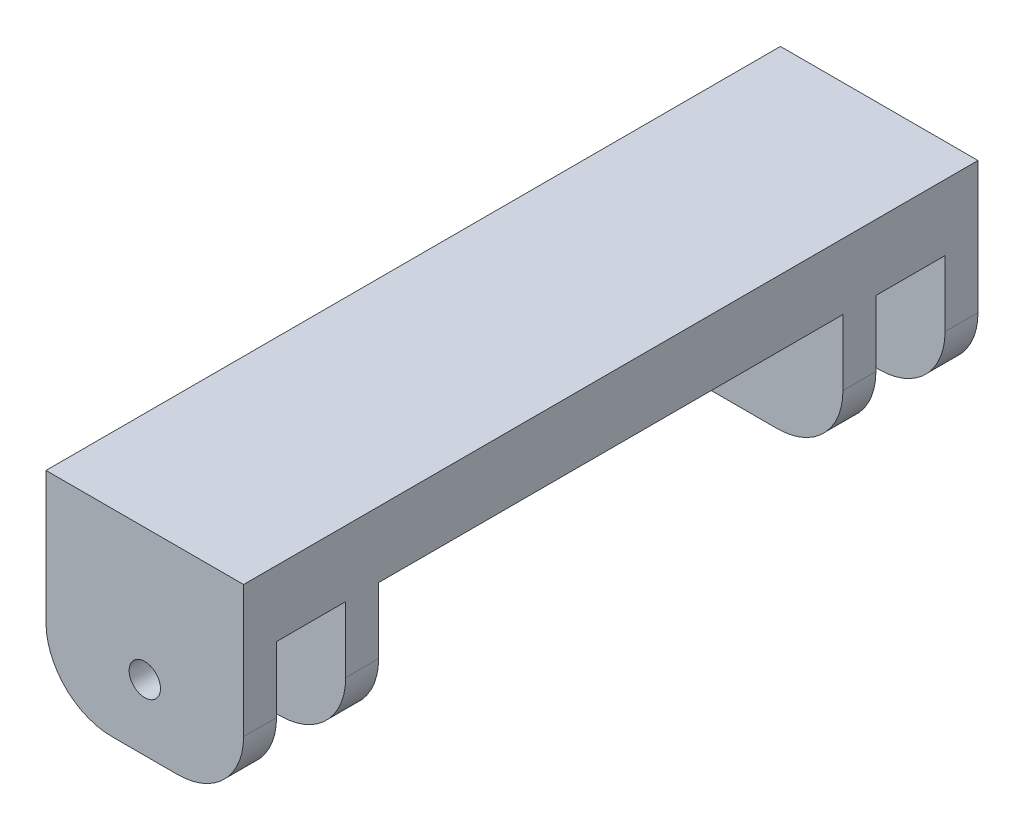
ISO-10303-21;
HEADER;
FILE_DESCRIPTION(('STEP AP214'),'2;1');
FILE_NAME('part.step','',(''),(''),'','','');
FILE_SCHEMA(('AUTOMOTIVE_DESIGN { 1 0 10303 214 1 1 1 1 }'));
ENDSEC;
DATA;
#1=APPLICATION_CONTEXT('core data for automotive mechanical design processes');
#2=APPLICATION_PROTOCOL_DEFINITION('international standard','automotive_design',2000,#1);
#3=PRODUCT_CONTEXT('',#1,'mechanical');
#4=PRODUCT('Part','Part','',(#3));
#5=PRODUCT_RELATED_PRODUCT_CATEGORY('part','',(#4));
#6=PRODUCT_DEFINITION_FORMATION('','',#4);
#7=PRODUCT_DEFINITION_CONTEXT('part definition',#1,'design');
#8=PRODUCT_DEFINITION('design','',#6,#7);
#9=PRODUCT_DEFINITION_SHAPE('','',#8);
#10=(LENGTH_UNIT() NAMED_UNIT(*) SI_UNIT(.MILLI.,.METRE.));
#11=(NAMED_UNIT(*) PLANE_ANGLE_UNIT() SI_UNIT($,.RADIAN.));
#12=(NAMED_UNIT(*) SI_UNIT($,.STERADIAN.) SOLID_ANGLE_UNIT());
#13=UNCERTAINTY_MEASURE_WITH_UNIT(LENGTH_MEASURE(1.E-05),#10,'distance_accuracy_value','');
#14=(GEOMETRIC_REPRESENTATION_CONTEXT(3) GLOBAL_UNCERTAINTY_ASSIGNED_CONTEXT((#13)) GLOBAL_UNIT_ASSIGNED_CONTEXT((#10,
#11,#12)) REPRESENTATION_CONTEXT('',''));
#15=CARTESIAN_POINT('',(0.,0.,0.));
#16=DIRECTION('',(0.,0.,1.));
#17=DIRECTION('',(1.,0.,0.));
#18=AXIS2_PLACEMENT_3D('',#15,#16,#17);
#19=CARTESIAN_POINT('',(0.,0.,111.5));
#20=DIRECTION('',(0.,1.,0.));
#21=DIRECTION('',(0.,0.,1.));
#22=AXIS2_PLACEMENT_3D('',#19,#20,#21);
#23=PLANE('',#22);
#24=DIRECTION('',(-1.,0.,0.));
#25=VECTOR('',#24,1.);
#26=CARTESIAN_POINT('',(30.,0.,96.));
#27=LINE('',#26,#25);
#28=CARTESIAN_POINT('',(30.,0.,96.));
#29=VERTEX_POINT('',#28);
#30=CARTESIAN_POINT('',(0.,0.,96.));
#31=VERTEX_POINT('',#30);
#32=EDGE_CURVE('E203',#29,#31,#27,.T.);
#33=ORIENTED_EDGE('',*,*,#32,.F.);
#34=DIRECTION('',(0.,0.,-1.));
#35=VECTOR('',#34,1.);
#36=CARTESIAN_POINT('',(30.,0.,111.5));
#37=LINE('',#36,#35);
#38=CARTESIAN_POINT('',(30.,0.,106.5));
#39=VERTEX_POINT('',#38);
#40=EDGE_CURVE('E215',#39,#29,#37,.T.);
#41=ORIENTED_EDGE('',*,*,#40,.F.);
#42=DIRECTION('',(1.,0.,0.));
#43=VECTOR('',#42,1.);
#44=CARTESIAN_POINT('',(0.,0.,106.5));
#45=LINE('',#44,#43);
#46=CARTESIAN_POINT('',(0.,0.,106.5));
#47=VERTEX_POINT('',#46);
#48=EDGE_CURVE('E209',#47,#39,#45,.T.);
#49=ORIENTED_EDGE('',*,*,#48,.F.);
#50=DIRECTION('',(0.,0.,-1.));
#51=VECTOR('',#50,1.);
#52=CARTESIAN_POINT('',(0.,0.,111.5));
#53=LINE('',#52,#51);
#54=EDGE_CURVE('E217',#47,#31,#53,.T.);
#55=ORIENTED_EDGE('',*,*,#54,.T.);
#56=EDGE_LOOP('',(#33,#41,#49,#55));
#57=FACE_BOUND('',#56,.T.);
#58=ADVANCED_FACE('F35',(#57),#23,.F.);
#59=DIRECTION('',(1.,0.,0.));
#60=VECTOR('',#59,1.);
#61=CARTESIAN_POINT('',(30.,0.,91.));
#62=LINE('',#61,#60);
#63=CARTESIAN_POINT('',(0.,0.,91.));
#64=VERTEX_POINT('',#63);
#65=CARTESIAN_POINT('',(30.,0.,91.));
#66=VERTEX_POINT('',#65);
#67=EDGE_CURVE('E218',#64,#66,#62,.T.);
#68=ORIENTED_EDGE('',*,*,#67,.F.);
#69=CARTESIAN_POINT('',(0.,0.,20.5));
#70=VERTEX_POINT('',#69);
#71=EDGE_CURVE('E231',#64,#70,#53,.T.);
#72=ORIENTED_EDGE('',*,*,#71,.T.);
#73=DIRECTION('',(-1.,0.,0.));
#74=VECTOR('',#73,1.);
#75=CARTESIAN_POINT('',(30.,0.,20.5));
#76=LINE('',#75,#74);
#77=CARTESIAN_POINT('',(30.,0.,20.5));
#78=VERTEX_POINT('',#77);
#79=EDGE_CURVE('E288',#78,#70,#76,.T.);
#80=ORIENTED_EDGE('',*,*,#79,.F.);
#81=EDGE_CURVE('E227',#66,#78,#37,.T.);
#82=ORIENTED_EDGE('',*,*,#81,.F.);
#83=EDGE_LOOP('',(#68,#72,#80,#82));
#84=FACE_BOUND('',#83,.T.);
#85=ADVANCED_FACE('F441',(#84),#23,.F.);
#86=DIRECTION('',(1.,0.,0.));
#87=VECTOR('',#86,1.);
#88=CARTESIAN_POINT('',(30.,0.,15.5));
#89=LINE('',#88,#87);
#90=CARTESIAN_POINT('',(0.,0.,15.5));
#91=VERTEX_POINT('',#90);
#92=CARTESIAN_POINT('',(30.,0.,15.5));
#93=VERTEX_POINT('',#92);
#94=EDGE_CURVE('E284',#91,#93,#89,.T.);
#95=ORIENTED_EDGE('',*,*,#94,.F.);
#96=CARTESIAN_POINT('',(0.,0.,5.));
#97=VERTEX_POINT('',#96);
#98=EDGE_CURVE('E226',#91,#97,#53,.T.);
#99=ORIENTED_EDGE('',*,*,#98,.T.);
#100=DIRECTION('',(-1.,0.,0.));
#101=VECTOR('',#100,1.);
#102=CARTESIAN_POINT('',(0.,0.,5.));
#103=LINE('',#102,#101);
#104=CARTESIAN_POINT('',(30.,0.,5.00000000000003));
#105=VERTEX_POINT('',#104);
#106=EDGE_CURVE('E267',#105,#97,#103,.T.);
#107=ORIENTED_EDGE('',*,*,#106,.F.);
#108=EDGE_CURVE('E229',#93,#105,#37,.T.);
#109=ORIENTED_EDGE('',*,*,#108,.F.);
#110=EDGE_LOOP('',(#95,#99,#107,#109));
#111=FACE_BOUND('',#110,.T.);
#112=ADVANCED_FACE('F474',(#111),#23,.F.);
#113=CARTESIAN_POINT('',(0.,0.,111.5));
#114=DIRECTION('',(1.,0.,0.));
#115=DIRECTION('',(0.,0.,-1.));
#116=AXIS2_PLACEMENT_3D('',#113,#114,#115);
#117=PLANE('',#116);
#118=DIRECTION('',(0.,1.,0.));
#119=VECTOR('',#118,1.);
#120=CARTESIAN_POINT('',(0.,-20.,15.5));
#121=LINE('',#120,#119);
#122=CARTESIAN_POINT('',(0.,-10.,15.5));
#123=VERTEX_POINT('',#122);
#124=EDGE_CURVE('E279',#123,#91,#121,.T.);
#125=ORIENTED_EDGE('',*,*,#124,.F.);
#126=DIRECTION('',(0.,0.,-1.));
#127=VECTOR('',#126,1.);
#128=CARTESIAN_POINT('',(0.,-10.,20.5));
#129=LINE('',#128,#127);
#130=CARTESIAN_POINT('',(0.,-10.,20.5));
#131=VERTEX_POINT('',#130);
#132=EDGE_CURVE('E383',#123,#131,#129,.F.);
#133=ORIENTED_EDGE('',*,*,#132,.T.);
#134=DIRECTION('',(0.,1.,0.));
#135=VECTOR('',#134,1.);
#136=CARTESIAN_POINT('',(0.,-20.,20.5));
#137=LINE('',#136,#135);
#138=EDGE_CURVE('E277',#131,#70,#137,.T.);
#139=ORIENTED_EDGE('',*,*,#138,.T.);
#140=ORIENTED_EDGE('',*,*,#71,.F.);
#141=DIRECTION('',(0.,1.,0.));
#142=VECTOR('',#141,1.);
#143=CARTESIAN_POINT('',(0.,-20.,91.));
#144=LINE('',#143,#142);
#145=CARTESIAN_POINT('',(0.,-10.,91.));
#146=VERTEX_POINT('',#145);
#147=EDGE_CURVE('E305',#146,#64,#144,.T.);
#148=ORIENTED_EDGE('',*,*,#147,.F.);
#149=DIRECTION('',(0.,0.,-1.));
#150=VECTOR('',#149,1.);
#151=CARTESIAN_POINT('',(0.,-10.,111.5));
#152=LINE('',#151,#150);
#153=CARTESIAN_POINT('',(0.,-10.,96.));
#154=VERTEX_POINT('',#153);
#155=EDGE_CURVE('E373',#146,#154,#152,.F.);
#156=ORIENTED_EDGE('',*,*,#155,.T.);
#157=DIRECTION('',(0.,1.,0.));
#158=VECTOR('',#157,1.);
#159=CARTESIAN_POINT('',(0.,-20.,96.));
#160=LINE('',#159,#158);
#161=EDGE_CURVE('E210',#154,#31,#160,.T.);
#162=ORIENTED_EDGE('',*,*,#161,.T.);
#163=ORIENTED_EDGE('',*,*,#54,.F.);
#164=DIRECTION('',(0.,1.,0.));
#165=VECTOR('',#164,1.);
#166=CARTESIAN_POINT('',(0.,-20.,106.5));
#167=LINE('',#166,#165);
#168=CARTESIAN_POINT('',(0.,-10.,106.5));
#169=VERTEX_POINT('',#168);
#170=EDGE_CURVE('E291',#169,#47,#167,.T.);
#171=ORIENTED_EDGE('',*,*,#170,.F.);
#172=DIRECTION('',(0.,0.,-1.));
#173=VECTOR('',#172,1.);
#174=CARTESIAN_POINT('',(0.,-10.,111.5));
#175=LINE('',#174,#173);
#176=CARTESIAN_POINT('',(0.,-10.,111.5));
#177=VERTEX_POINT('',#176);
#178=EDGE_CURVE('E372',#169,#177,#175,.F.);
#179=ORIENTED_EDGE('',*,*,#178,.T.);
#180=DIRECTION('',(0.,-1.,0.));
#181=VECTOR('',#180,1.);
#182=CARTESIAN_POINT('',(0.,0.,111.5));
#183=LINE('',#182,#181);
#184=CARTESIAN_POINT('',(0.,10.,111.5));
#185=VERTEX_POINT('',#184);
#186=EDGE_CURVE('E252',#185,#177,#183,.T.);
#187=ORIENTED_EDGE('',*,*,#186,.F.);
#188=DIRECTION('',(0.,0.,-1.));
#189=VECTOR('',#188,1.);
#190=CARTESIAN_POINT('',(0.,10.,111.5));
#191=LINE('',#190,#189);
#192=CARTESIAN_POINT('',(0.,10.,0.));
#193=VERTEX_POINT('',#192);
#194=EDGE_CURVE('E241',#185,#193,#191,.T.);
#195=ORIENTED_EDGE('',*,*,#194,.T.);
#196=DIRECTION('',(0.,-1.,0.));
#197=VECTOR('',#196,1.);
#198=CARTESIAN_POINT('',(0.,0.,0.));
#199=LINE('',#198,#197);
#200=CARTESIAN_POINT('',(0.,-10.,0.));
#201=VERTEX_POINT('',#200);
#202=EDGE_CURVE('E255',#193,#201,#199,.T.);
#203=ORIENTED_EDGE('',*,*,#202,.T.);
#204=DIRECTION('',(0.,0.,-1.));
#205=VECTOR('',#204,1.);
#206=CARTESIAN_POINT('',(0.,-10.,111.5));
#207=LINE('',#206,#205);
#208=CARTESIAN_POINT('',(0.,-10.,5.));
#209=VERTEX_POINT('',#208);
#210=EDGE_CURVE('E376',#201,#209,#207,.F.);
#211=ORIENTED_EDGE('',*,*,#210,.T.);
#212=DIRECTION('',(0.,1.,0.));
#213=VECTOR('',#212,1.);
#214=CARTESIAN_POINT('',(0.,-20.,5.));
#215=LINE('',#214,#213);
#216=EDGE_CURVE('E264',#209,#97,#215,.T.);
#217=ORIENTED_EDGE('',*,*,#216,.T.);
#218=ORIENTED_EDGE('',*,*,#98,.F.);
#219=EDGE_LOOP('',(#125,#133,#139,#140,#148,#156,#162,#163,#171,#179,#187,#195,#203,#211,#217,#218));
#220=FACE_BOUND('',#219,.T.);
#221=ADVANCED_FACE('F370',(#220),#117,.F.);
#222=CARTESIAN_POINT('',(30.,0.,111.5));
#223=DIRECTION('',(-1.,0.,0.));
#224=DIRECTION('',(0.,0.,1.));
#225=AXIS2_PLACEMENT_3D('',#222,#223,#224);
#226=PLANE('',#225);
#227=DIRECTION('',(0.,1.,0.));
#228=VECTOR('',#227,1.);
#229=CARTESIAN_POINT('',(30.,-20.,20.5));
#230=LINE('',#229,#228);
#231=CARTESIAN_POINT('',(30.,-10.,20.5));
#232=VERTEX_POINT('',#231);
#233=EDGE_CURVE('E271',#232,#78,#230,.T.);
#234=ORIENTED_EDGE('',*,*,#233,.F.);
#235=DIRECTION('',(0.,0.,1.));
#236=VECTOR('',#235,1.);
#237=CARTESIAN_POINT('',(30.,-10.,15.5));
#238=LINE('',#237,#236);
#239=CARTESIAN_POINT('',(30.,-10.,15.5));
#240=VERTEX_POINT('',#239);
#241=EDGE_CURVE('E395',#232,#240,#238,.F.);
#242=ORIENTED_EDGE('',*,*,#241,.T.);
#243=DIRECTION('',(0.,1.,0.));
#244=VECTOR('',#243,1.);
#245=CARTESIAN_POINT('',(30.,-20.,15.5));
#246=LINE('',#245,#244);
#247=EDGE_CURVE('E281',#240,#93,#246,.T.);
#248=ORIENTED_EDGE('',*,*,#247,.T.);
#249=ORIENTED_EDGE('',*,*,#108,.T.);
#250=DIRECTION('',(0.,1.,0.));
#251=VECTOR('',#250,1.);
#252=CARTESIAN_POINT('',(30.,-20.,5.));
#253=LINE('',#252,#251);
#254=CARTESIAN_POINT('',(30.,-10.,5.));
#255=VERTEX_POINT('',#254);
#256=EDGE_CURVE('E258',#255,#105,#253,.T.);
#257=ORIENTED_EDGE('',*,*,#256,.F.);
#258=DIRECTION('',(0.,0.,1.));
#259=VECTOR('',#258,1.);
#260=CARTESIAN_POINT('',(30.,-10.,111.5));
#261=LINE('',#260,#259);
#262=CARTESIAN_POINT('',(30.,-10.,0.));
#263=VERTEX_POINT('',#262);
#264=EDGE_CURVE('E393',#255,#263,#261,.F.);
#265=ORIENTED_EDGE('',*,*,#264,.T.);
#266=DIRECTION('',(0.,1.,0.));
#267=VECTOR('',#266,1.);
#268=CARTESIAN_POINT('',(30.,0.,0.));
#269=LINE('',#268,#267);
#270=CARTESIAN_POINT('',(30.,10.,0.));
#271=VERTEX_POINT('',#270);
#272=EDGE_CURVE('E253',#263,#271,#269,.T.);
#273=ORIENTED_EDGE('',*,*,#272,.T.);
#274=DIRECTION('',(0.,0.,-1.));
#275=VECTOR('',#274,1.);
#276=CARTESIAN_POINT('',(30.,10.,111.5));
#277=LINE('',#276,#275);
#278=CARTESIAN_POINT('',(30.,10.,111.5));
#279=VERTEX_POINT('',#278);
#280=EDGE_CURVE('E236',#279,#271,#277,.T.);
#281=ORIENTED_EDGE('',*,*,#280,.F.);
#282=DIRECTION('',(0.,1.,0.));
#283=VECTOR('',#282,1.);
#284=CARTESIAN_POINT('',(30.,0.,111.5));
#285=LINE('',#284,#283);
#286=CARTESIAN_POINT('',(30.,-10.,111.5));
#287=VERTEX_POINT('',#286);
#288=EDGE_CURVE('E260',#287,#279,#285,.T.);
#289=ORIENTED_EDGE('',*,*,#288,.F.);
#290=DIRECTION('',(0.,0.,1.));
#291=VECTOR('',#290,1.);
#292=CARTESIAN_POINT('',(30.,-10.,106.5));
#293=LINE('',#292,#291);
#294=CARTESIAN_POINT('',(30.,-10.,106.5));
#295=VERTEX_POINT('',#294);
#296=EDGE_CURVE('E389',#287,#295,#293,.F.);
#297=ORIENTED_EDGE('',*,*,#296,.T.);
#298=DIRECTION('',(0.,1.,0.));
#299=VECTOR('',#298,1.);
#300=CARTESIAN_POINT('',(30.,-20.,106.5));
#301=LINE('',#300,#299);
#302=EDGE_CURVE('E224',#295,#39,#301,.T.);
#303=ORIENTED_EDGE('',*,*,#302,.T.);
#304=ORIENTED_EDGE('',*,*,#40,.T.);
#305=DIRECTION('',(0.,1.,0.));
#306=VECTOR('',#305,1.);
#307=CARTESIAN_POINT('',(30.,-20.,96.));
#308=LINE('',#307,#306);
#309=CARTESIAN_POINT('',(30.,-10.,96.));
#310=VERTEX_POINT('',#309);
#311=EDGE_CURVE('E198',#310,#29,#308,.T.);
#312=ORIENTED_EDGE('',*,*,#311,.F.);
#313=DIRECTION('',(0.,0.,1.));
#314=VECTOR('',#313,1.);
#315=CARTESIAN_POINT('',(30.,-10.,111.5));
#316=LINE('',#315,#314);
#317=CARTESIAN_POINT('',(30.,-10.,91.));
#318=VERTEX_POINT('',#317);
#319=EDGE_CURVE('E391',#310,#318,#316,.F.);
#320=ORIENTED_EDGE('',*,*,#319,.T.);
#321=DIRECTION('',(0.,1.,0.));
#322=VECTOR('',#321,1.);
#323=CARTESIAN_POINT('',(30.,-20.,91.));
#324=LINE('',#323,#322);
#325=EDGE_CURVE('E307',#318,#66,#324,.T.);
#326=ORIENTED_EDGE('',*,*,#325,.T.);
#327=ORIENTED_EDGE('',*,*,#81,.T.);
#328=EDGE_LOOP('',(#234,#242,#248,#249,#257,#265,#273,#281,#289,#297,#303,#304,#312,#320,#326,#327));
#329=FACE_BOUND('',#328,.T.);
#330=ADVANCED_FACE('F222',(#329),#226,.F.);
#331=CARTESIAN_POINT('',(0.,10.,111.5));
#332=DIRECTION('',(0.,-1.,0.));
#333=DIRECTION('',(0.,0.,-1.));
#334=AXIS2_PLACEMENT_3D('',#331,#332,#333);
#335=PLANE('',#334);
#336=DIRECTION('',(-1.,0.,0.));
#337=VECTOR('',#336,1.);
#338=CARTESIAN_POINT('',(0.,10.,0.));
#339=LINE('',#338,#337);
#340=EDGE_CURVE('E250',#271,#193,#339,.T.);
#341=ORIENTED_EDGE('',*,*,#340,.T.);
#342=ORIENTED_EDGE('',*,*,#194,.F.);
#343=DIRECTION('',(-1.,0.,0.));
#344=VECTOR('',#343,1.);
#345=CARTESIAN_POINT('',(0.,10.,111.5));
#346=LINE('',#345,#344);
#347=EDGE_CURVE('E247',#279,#185,#346,.T.);
#348=ORIENTED_EDGE('',*,*,#347,.F.);
#349=ORIENTED_EDGE('',*,*,#280,.T.);
#350=EDGE_LOOP('',(#341,#342,#348,#349));
#351=FACE_BOUND('',#350,.T.);
#352=ADVANCED_FACE('F345',(#351),#335,.F.);
#353=CARTESIAN_POINT('',(0.,0.,111.5));
#354=DIRECTION('',(0.,0.,-1.));
#355=DIRECTION('',(-1.,0.,0.));
#356=AXIS2_PLACEMENT_3D('',#353,#354,#355);
#357=PLANE('',#356);
#358=CARTESIAN_POINT('',(15.,-10.,111.5));
#359=DIRECTION('',(0.,0.,1.));
#360=DIRECTION('',(1.,0.,0.));
#361=AXIS2_PLACEMENT_3D('',#358,#359,#360);
#362=CIRCLE('',#361,2.38124999999999);
#363=CARTESIAN_POINT('',(17.38125,-10.,111.5));
#364=VERTEX_POINT('',#363);
#365=EDGE_CURVE('E335',#364,#364,#362,.T.);
#366=ORIENTED_EDGE('',*,*,#365,.F.);
#367=EDGE_LOOP('',(#366));
#368=FACE_BOUND('',#367,.T.);
#369=DIRECTION('',(-1.,0.,0.));
#370=VECTOR('',#369,1.);
#371=CARTESIAN_POINT('',(0.,-20.,111.5));
#372=LINE('',#371,#370);
#373=CARTESIAN_POINT('',(20.,-20.,111.5));
#374=VERTEX_POINT('',#373);
#375=CARTESIAN_POINT('',(9.99999999999999,-20.,111.5));
#376=VERTEX_POINT('',#375);
#377=EDGE_CURVE('E298',#374,#376,#372,.T.);
#378=ORIENTED_EDGE('',*,*,#377,.F.);
#379=CARTESIAN_POINT('',(20.,-10.,111.5));
#380=DIRECTION('',(0.,0.,-1.));
#381=DIRECTION('',(-1.,0.,0.));
#382=AXIS2_PLACEMENT_3D('',#379,#380,#381);
#383=CIRCLE('',#382,10.);
#384=EDGE_CURVE('E58',#374,#287,#383,.F.);
#385=ORIENTED_EDGE('',*,*,#384,.T.);
#386=ORIENTED_EDGE('',*,*,#288,.T.);
#387=ORIENTED_EDGE('',*,*,#347,.T.);
#388=ORIENTED_EDGE('',*,*,#186,.T.);
#389=CARTESIAN_POINT('',(10.,-10.,111.5));
#390=DIRECTION('',(0.,0.,-1.));
#391=DIRECTION('',(-1.,0.,0.));
#392=AXIS2_PLACEMENT_3D('',#389,#390,#391);
#393=CIRCLE('',#392,10.);
#394=EDGE_CURVE('E50',#177,#376,#393,.F.);
#395=ORIENTED_EDGE('',*,*,#394,.T.);
#396=EDGE_LOOP('',(#378,#385,#386,#387,#388,#395));
#397=FACE_BOUND('',#396,.T.);
#398=ADVANCED_FACE('F342',(#368,#397),#357,.F.);
#399=CARTESIAN_POINT('',(0.,0.,0.));
#400=DIRECTION('',(0.,0.,-1.));
#401=DIRECTION('',(-1.,0.,0.));
#402=AXIS2_PLACEMENT_3D('',#399,#400,#401);
#403=PLANE('',#402);
#404=CARTESIAN_POINT('',(15.,-10.,0.));
#405=DIRECTION('',(0.,0.,1.));
#406=DIRECTION('',(1.,0.,0.));
#407=AXIS2_PLACEMENT_3D('',#404,#405,#406);
#408=CIRCLE('',#407,2.38124999999998);
#409=CARTESIAN_POINT('',(17.38125,-10.,0.));
#410=VERTEX_POINT('',#409);
#411=EDGE_CURVE('E332',#410,#410,#408,.T.);
#412=ORIENTED_EDGE('',*,*,#411,.T.);
#413=EDGE_LOOP('',(#412));
#414=FACE_BOUND('',#413,.T.);
#415=DIRECTION('',(1.,0.,0.));
#416=VECTOR('',#415,1.);
#417=CARTESIAN_POINT('',(0.,-20.,0.));
#418=LINE('',#417,#416);
#419=CARTESIAN_POINT('',(9.99999999999999,-20.,0.));
#420=VERTEX_POINT('',#419);
#421=CARTESIAN_POINT('',(20.,-20.,0.));
#422=VERTEX_POINT('',#421);
#423=EDGE_CURVE('E270',#420,#422,#418,.T.);
#424=ORIENTED_EDGE('',*,*,#423,.F.);
#425=CARTESIAN_POINT('',(10.,-10.,0.));
#426=DIRECTION('',(0.,0.,-1.));
#427=DIRECTION('',(-1.,0.,0.));
#428=AXIS2_PLACEMENT_3D('',#425,#426,#427);
#429=CIRCLE('',#428,10.);
#430=EDGE_CURVE('E405',#420,#201,#429,.T.);
#431=ORIENTED_EDGE('',*,*,#430,.T.);
#432=ORIENTED_EDGE('',*,*,#202,.F.);
#433=ORIENTED_EDGE('',*,*,#340,.F.);
#434=ORIENTED_EDGE('',*,*,#272,.F.);
#435=CARTESIAN_POINT('',(20.,-10.,0.));
#436=DIRECTION('',(0.,0.,-1.));
#437=DIRECTION('',(-1.,0.,0.));
#438=AXIS2_PLACEMENT_3D('',#435,#436,#437);
#439=CIRCLE('',#438,10.);
#440=EDGE_CURVE('E403',#263,#422,#439,.T.);
#441=ORIENTED_EDGE('',*,*,#440,.T.);
#442=EDGE_LOOP('',(#424,#431,#432,#433,#434,#441));
#443=FACE_BOUND('',#442,.T.);
#444=ADVANCED_FACE('F344',(#414,#443),#403,.T.);
#445=CARTESIAN_POINT('',(0.,-20.,5.));
#446=DIRECTION('',(0.,0.,-1.));
#447=DIRECTION('',(-1.,0.,0.));
#448=AXIS2_PLACEMENT_3D('',#445,#446,#447);
#449=PLANE('',#448);
#450=CARTESIAN_POINT('',(15.,-10.,5.));
#451=DIRECTION('',(0.,0.,-1.));
#452=DIRECTION('',(-1.,0.,0.));
#453=AXIS2_PLACEMENT_3D('',#450,#451,#452);
#454=CIRCLE('',#453,2.38124999999998);
#455=CARTESIAN_POINT('',(12.61875,-10.,5.));
#456=VERTEX_POINT('',#455);
#457=EDGE_CURVE('E219',#456,#456,#454,.T.);
#458=ORIENTED_EDGE('',*,*,#457,.T.);
#459=EDGE_LOOP('',(#458));
#460=FACE_BOUND('',#459,.T.);
#461=ORIENTED_EDGE('',*,*,#216,.F.);
#462=CARTESIAN_POINT('',(10.,-10.,5.));
#463=DIRECTION('',(0.,0.,-1.));
#464=DIRECTION('',(-1.,0.,0.));
#465=AXIS2_PLACEMENT_3D('',#462,#463,#464);
#466=CIRCLE('',#465,10.);
#467=CARTESIAN_POINT('',(9.99999999999999,-20.,5.));
#468=VERTEX_POINT('',#467);
#469=EDGE_CURVE('E409',#209,#468,#466,.F.);
#470=ORIENTED_EDGE('',*,*,#469,.T.);
#471=DIRECTION('',(-1.,0.,0.));
#472=VECTOR('',#471,1.);
#473=CARTESIAN_POINT('',(0.,-20.,5.));
#474=LINE('',#473,#472);
#475=CARTESIAN_POINT('',(20.,-20.,5.));
#476=VERTEX_POINT('',#475);
#477=EDGE_CURVE('E266',#476,#468,#474,.T.);
#478=ORIENTED_EDGE('',*,*,#477,.F.);
#479=CARTESIAN_POINT('',(20.,-10.,5.));
#480=DIRECTION('',(0.,0.,-1.));
#481=DIRECTION('',(-1.,0.,0.));
#482=AXIS2_PLACEMENT_3D('',#479,#480,#481);
#483=CIRCLE('',#482,10.);
#484=EDGE_CURVE('E407',#476,#255,#483,.F.);
#485=ORIENTED_EDGE('',*,*,#484,.T.);
#486=ORIENTED_EDGE('',*,*,#256,.T.);
#487=ORIENTED_EDGE('',*,*,#106,.T.);
#488=EDGE_LOOP('',(#461,#470,#478,#485,#486,#487));
#489=FACE_BOUND('',#488,.T.);
#490=ADVANCED_FACE('F476',(#460,#489),#449,.F.);
#491=CARTESIAN_POINT('',(0.,-20.,0.));
#492=DIRECTION('',(0.,1.,0.));
#493=DIRECTION('',(0.,0.,1.));
#494=AXIS2_PLACEMENT_3D('',#491,#492,#493);
#495=PLANE('',#494);
#496=ORIENTED_EDGE('',*,*,#477,.T.);
#497=DIRECTION('',(0.,0.,-1.));
#498=VECTOR('',#497,1.);
#499=CARTESIAN_POINT('',(10.,-20.,0.));
#500=LINE('',#499,#498);
#501=EDGE_CURVE('E400',#468,#420,#500,.T.);
#502=ORIENTED_EDGE('',*,*,#501,.T.);
#503=ORIENTED_EDGE('',*,*,#423,.T.);
#504=DIRECTION('',(0.,0.,1.));
#505=VECTOR('',#504,1.);
#506=CARTESIAN_POINT('',(20.,-20.,0.));
#507=LINE('',#506,#505);
#508=EDGE_CURVE('E397',#422,#476,#507,.T.);
#509=ORIENTED_EDGE('',*,*,#508,.T.);
#510=EDGE_LOOP('',(#496,#502,#503,#509));
#511=FACE_BOUND('',#510,.T.);
#512=ADVANCED_FACE('F488',(#511),#495,.F.);
#513=CARTESIAN_POINT('',(30.,-20.,20.5));
#514=DIRECTION('',(0.,0.,-1.));
#515=DIRECTION('',(-1.,0.,0.));
#516=AXIS2_PLACEMENT_3D('',#513,#514,#515);
#517=PLANE('',#516);
#518=CARTESIAN_POINT('',(15.,-10.,20.5));
#519=DIRECTION('',(0.,0.,-1.));
#520=DIRECTION('',(-1.,0.,0.));
#521=AXIS2_PLACEMENT_3D('',#518,#519,#520);
#522=CIRCLE('',#521,2.38124999999998);
#523=CARTESIAN_POINT('',(12.61875,-10.,20.5));
#524=VERTEX_POINT('',#523);
#525=EDGE_CURVE('E322',#524,#524,#522,.T.);
#526=ORIENTED_EDGE('',*,*,#525,.T.);
#527=EDGE_LOOP('',(#526));
#528=FACE_BOUND('',#527,.T.);
#529=ORIENTED_EDGE('',*,*,#138,.F.);
#530=CARTESIAN_POINT('',(10.,-10.,20.5));
#531=DIRECTION('',(0.,0.,-1.));
#532=DIRECTION('',(-1.,0.,0.));
#533=AXIS2_PLACEMENT_3D('',#530,#531,#532);
#534=CIRCLE('',#533,10.);
#535=CARTESIAN_POINT('',(10.,-20.,20.5));
#536=VERTEX_POINT('',#535);
#537=EDGE_CURVE('E387',#131,#536,#534,.F.);
#538=ORIENTED_EDGE('',*,*,#537,.T.);
#539=DIRECTION('',(-1.,0.,0.));
#540=VECTOR('',#539,1.);
#541=CARTESIAN_POINT('',(30.,-20.,20.5));
#542=LINE('',#541,#540);
#543=CARTESIAN_POINT('',(20.,-20.,20.5));
#544=VERTEX_POINT('',#543);
#545=EDGE_CURVE('E287',#544,#536,#542,.T.);
#546=ORIENTED_EDGE('',*,*,#545,.F.);
#547=CARTESIAN_POINT('',(20.,-10.,20.5));
#548=DIRECTION('',(0.,0.,-1.));
#549=DIRECTION('',(-1.,0.,0.));
#550=AXIS2_PLACEMENT_3D('',#547,#548,#549);
#551=CIRCLE('',#550,10.);
#552=EDGE_CURVE('E385',#544,#232,#551,.F.);
#553=ORIENTED_EDGE('',*,*,#552,.T.);
#554=ORIENTED_EDGE('',*,*,#233,.T.);
#555=ORIENTED_EDGE('',*,*,#79,.T.);
#556=EDGE_LOOP('',(#529,#538,#546,#553,#554,#555));
#557=FACE_BOUND('',#556,.T.);
#558=ADVANCED_FACE('F460',(#528,#557),#517,.F.);
#559=CARTESIAN_POINT('',(30.,-20.,15.5));
#560=DIRECTION('',(0.,0.,1.));
#561=DIRECTION('',(1.,0.,0.));
#562=AXIS2_PLACEMENT_3D('',#559,#560,#561);
#563=PLANE('',#562);
#564=CARTESIAN_POINT('',(15.,-10.,15.5));
#565=DIRECTION('',(0.,0.,1.));
#566=DIRECTION('',(1.,0.,0.));
#567=AXIS2_PLACEMENT_3D('',#564,#565,#566);
#568=CIRCLE('',#567,2.38124999999998);
#569=CARTESIAN_POINT('',(17.38125,-10.,15.5));
#570=VERTEX_POINT('',#569);
#571=EDGE_CURVE('E325',#570,#570,#568,.T.);
#572=ORIENTED_EDGE('',*,*,#571,.T.);
#573=EDGE_LOOP('',(#572));
#574=FACE_BOUND('',#573,.T.);
#575=DIRECTION('',(1.,0.,0.));
#576=VECTOR('',#575,1.);
#577=CARTESIAN_POINT('',(30.,-20.,15.5));
#578=LINE('',#577,#576);
#579=CARTESIAN_POINT('',(10.,-20.,15.5));
#580=VERTEX_POINT('',#579);
#581=CARTESIAN_POINT('',(20.,-20.,15.5));
#582=VERTEX_POINT('',#581);
#583=EDGE_CURVE('E283',#580,#582,#578,.T.);
#584=ORIENTED_EDGE('',*,*,#583,.F.);
#585=CARTESIAN_POINT('',(10.,-10.,15.5));
#586=DIRECTION('',(0.,0.,1.));
#587=DIRECTION('',(1.,0.,0.));
#588=AXIS2_PLACEMENT_3D('',#585,#586,#587);
#589=CIRCLE('',#588,10.);
#590=EDGE_CURVE('E374',#580,#123,#589,.F.);
#591=ORIENTED_EDGE('',*,*,#590,.T.);
#592=ORIENTED_EDGE('',*,*,#124,.T.);
#593=ORIENTED_EDGE('',*,*,#94,.T.);
#594=ORIENTED_EDGE('',*,*,#247,.F.);
#595=CARTESIAN_POINT('',(20.,-10.,15.5));
#596=DIRECTION('',(0.,0.,1.));
#597=DIRECTION('',(1.,0.,0.));
#598=AXIS2_PLACEMENT_3D('',#595,#596,#597);
#599=CIRCLE('',#598,10.);
#600=EDGE_CURVE('E378',#240,#582,#599,.F.);
#601=ORIENTED_EDGE('',*,*,#600,.T.);
#602=EDGE_LOOP('',(#584,#591,#592,#593,#594,#601));
#603=FACE_BOUND('',#602,.T.);
#604=ADVANCED_FACE('F469',(#574,#603),#563,.F.);
#605=CARTESIAN_POINT('',(0.,-20.,0.));
#606=DIRECTION('',(0.,-1.,0.));
#607=DIRECTION('',(0.,0.,-1.));
#608=AXIS2_PLACEMENT_3D('',#605,#606,#607);
#609=PLANE('',#608);
#610=ORIENTED_EDGE('',*,*,#545,.T.);
#611=DIRECTION('',(0.,0.,-1.));
#612=VECTOR('',#611,1.);
#613=CARTESIAN_POINT('',(10.,-20.,15.5));
#614=LINE('',#613,#612);
#615=EDGE_CURVE('E453',#536,#580,#614,.T.);
#616=ORIENTED_EDGE('',*,*,#615,.T.);
#617=ORIENTED_EDGE('',*,*,#583,.T.);
#618=DIRECTION('',(0.,0.,1.));
#619=VECTOR('',#618,1.);
#620=CARTESIAN_POINT('',(20.,-20.,20.5));
#621=LINE('',#620,#619);
#622=EDGE_CURVE('E450',#582,#544,#621,.T.);
#623=ORIENTED_EDGE('',*,*,#622,.T.);
#624=EDGE_LOOP('',(#610,#616,#617,#623));
#625=FACE_BOUND('',#624,.T.);
#626=ADVANCED_FACE('F468',(#625),#609,.T.);
#627=CARTESIAN_POINT('',(0.,-20.,106.5));
#628=DIRECTION('',(0.,0.,1.));
#629=DIRECTION('',(1.,0.,0.));
#630=AXIS2_PLACEMENT_3D('',#627,#628,#629);
#631=PLANE('',#630);
#632=CARTESIAN_POINT('',(15.,-10.,106.5));
#633=DIRECTION('',(0.,0.,1.));
#634=DIRECTION('',(1.,0.,0.));
#635=AXIS2_PLACEMENT_3D('',#632,#633,#634);
#636=CIRCLE('',#635,2.38124999999998);
#637=CARTESIAN_POINT('',(17.38125,-10.,106.5));
#638=VERTEX_POINT('',#637);
#639=EDGE_CURVE('E319',#638,#638,#636,.T.);
#640=ORIENTED_EDGE('',*,*,#639,.T.);
#641=EDGE_LOOP('',(#640));
#642=FACE_BOUND('',#641,.T.);
#643=ORIENTED_EDGE('',*,*,#302,.F.);
#644=CARTESIAN_POINT('',(20.,-10.,106.5));
#645=DIRECTION('',(0.,0.,1.));
#646=DIRECTION('',(1.,0.,0.));
#647=AXIS2_PLACEMENT_3D('',#644,#645,#646);
#648=CIRCLE('',#647,10.);
#649=CARTESIAN_POINT('',(20.,-20.,106.5));
#650=VERTEX_POINT('',#649);
#651=EDGE_CURVE('E11',#295,#650,#648,.F.);
#652=ORIENTED_EDGE('',*,*,#651,.T.);
#653=DIRECTION('',(1.,0.,0.));
#654=VECTOR('',#653,1.);
#655=CARTESIAN_POINT('',(0.,-20.,106.5));
#656=LINE('',#655,#654);
#657=CARTESIAN_POINT('',(9.99999999999999,-20.,106.5));
#658=VERTEX_POINT('',#657);
#659=EDGE_CURVE('E300',#658,#650,#656,.T.);
#660=ORIENTED_EDGE('',*,*,#659,.F.);
#661=CARTESIAN_POINT('',(10.,-10.,106.5));
#662=DIRECTION('',(0.,0.,1.));
#663=DIRECTION('',(1.,0.,0.));
#664=AXIS2_PLACEMENT_3D('',#661,#662,#663);
#665=CIRCLE('',#664,10.);
#666=EDGE_CURVE('E43',#658,#169,#665,.F.);
#667=ORIENTED_EDGE('',*,*,#666,.T.);
#668=ORIENTED_EDGE('',*,*,#170,.T.);
#669=ORIENTED_EDGE('',*,*,#48,.T.);
#670=EDGE_LOOP('',(#643,#652,#660,#667,#668,#669));
#671=FACE_BOUND('',#670,.T.);
#672=ADVANCED_FACE('F367',(#642,#671),#631,.F.);
#673=CARTESIAN_POINT('',(0.,-20.,0.));
#674=DIRECTION('',(0.,-1.,0.));
#675=DIRECTION('',(0.,0.,-1.));
#676=AXIS2_PLACEMENT_3D('',#673,#674,#675);
#677=PLANE('',#676);
#678=ORIENTED_EDGE('',*,*,#659,.T.);
#679=DIRECTION('',(0.,0.,1.));
#680=VECTOR('',#679,1.);
#681=CARTESIAN_POINT('',(20.,-20.,111.5));
#682=LINE('',#681,#680);
#683=EDGE_CURVE('E354',#650,#374,#682,.T.);
#684=ORIENTED_EDGE('',*,*,#683,.T.);
#685=ORIENTED_EDGE('',*,*,#377,.T.);
#686=DIRECTION('',(0.,0.,-1.));
#687=VECTOR('',#686,1.);
#688=CARTESIAN_POINT('',(10.,-20.,106.5));
#689=LINE('',#688,#687);
#690=EDGE_CURVE('E352',#376,#658,#689,.T.);
#691=ORIENTED_EDGE('',*,*,#690,.T.);
#692=EDGE_LOOP('',(#678,#684,#685,#691));
#693=FACE_BOUND('',#692,.T.);
#694=ADVANCED_FACE('F351',(#693),#677,.T.);
#695=CARTESIAN_POINT('',(30.,-20.,96.));
#696=DIRECTION('',(0.,0.,-1.));
#697=DIRECTION('',(-1.,0.,0.));
#698=AXIS2_PLACEMENT_3D('',#695,#696,#697);
#699=PLANE('',#698);
#700=CARTESIAN_POINT('',(15.,-10.,96.));
#701=DIRECTION('',(0.,0.,-1.));
#702=DIRECTION('',(-1.,0.,0.));
#703=AXIS2_PLACEMENT_3D('',#700,#701,#702);
#704=CIRCLE('',#703,2.38124999999998);
#705=CARTESIAN_POINT('',(12.61875,-10.,96.));
#706=VERTEX_POINT('',#705);
#707=EDGE_CURVE('E328',#706,#706,#704,.T.);
#708=ORIENTED_EDGE('',*,*,#707,.T.);
#709=EDGE_LOOP('',(#708));
#710=FACE_BOUND('',#709,.T.);
#711=DIRECTION('',(-1.,0.,0.));
#712=VECTOR('',#711,1.);
#713=CARTESIAN_POINT('',(30.,-20.,96.));
#714=LINE('',#713,#712);
#715=CARTESIAN_POINT('',(20.,-20.,96.));
#716=VERTEX_POINT('',#715);
#717=CARTESIAN_POINT('',(10.,-20.,96.));
#718=VERTEX_POINT('',#717);
#719=EDGE_CURVE('E311',#716,#718,#714,.T.);
#720=ORIENTED_EDGE('',*,*,#719,.F.);
#721=CARTESIAN_POINT('',(20.,-10.,96.));
#722=DIRECTION('',(0.,0.,-1.));
#723=DIRECTION('',(-1.,0.,0.));
#724=AXIS2_PLACEMENT_3D('',#721,#722,#723);
#725=CIRCLE('',#724,10.);
#726=EDGE_CURVE('E205',#716,#310,#725,.F.);
#727=ORIENTED_EDGE('',*,*,#726,.T.);
#728=ORIENTED_EDGE('',*,*,#311,.T.);
#729=ORIENTED_EDGE('',*,*,#32,.T.);
#730=ORIENTED_EDGE('',*,*,#161,.F.);
#731=CARTESIAN_POINT('',(10.,-10.,96.));
#732=DIRECTION('',(0.,0.,-1.));
#733=DIRECTION('',(-1.,0.,0.));
#734=AXIS2_PLACEMENT_3D('',#731,#732,#733);
#735=CIRCLE('',#734,10.);
#736=EDGE_CURVE('E417',#154,#718,#735,.F.);
#737=ORIENTED_EDGE('',*,*,#736,.T.);
#738=EDGE_LOOP('',(#720,#727,#728,#729,#730,#737));
#739=FACE_BOUND('',#738,.T.);
#740=ADVANCED_FACE('F201',(#710,#739),#699,.F.);
#741=CARTESIAN_POINT('',(30.,-20.,91.));
#742=DIRECTION('',(0.,0.,1.));
#743=DIRECTION('',(1.,0.,0.));
#744=AXIS2_PLACEMENT_3D('',#741,#742,#743);
#745=PLANE('',#744);
#746=CARTESIAN_POINT('',(15.,-10.,91.));
#747=DIRECTION('',(0.,0.,1.));
#748=DIRECTION('',(1.,0.,0.));
#749=AXIS2_PLACEMENT_3D('',#746,#747,#748);
#750=CIRCLE('',#749,2.38124999999998);
#751=CARTESIAN_POINT('',(17.38125,-10.,91.));
#752=VERTEX_POINT('',#751);
#753=EDGE_CURVE('E331',#752,#752,#750,.T.);
#754=ORIENTED_EDGE('',*,*,#753,.T.);
#755=EDGE_LOOP('',(#754));
#756=FACE_BOUND('',#755,.T.);
#757=ORIENTED_EDGE('',*,*,#325,.F.);
#758=CARTESIAN_POINT('',(20.,-10.,91.));
#759=DIRECTION('',(0.,0.,1.));
#760=DIRECTION('',(1.,0.,0.));
#761=AXIS2_PLACEMENT_3D('',#758,#759,#760);
#762=CIRCLE('',#761,10.);
#763=CARTESIAN_POINT('',(20.,-20.,91.));
#764=VERTEX_POINT('',#763);
#765=EDGE_CURVE('E357',#318,#764,#762,.F.);
#766=ORIENTED_EDGE('',*,*,#765,.T.);
#767=DIRECTION('',(1.,0.,0.));
#768=VECTOR('',#767,1.);
#769=CARTESIAN_POINT('',(30.,-20.,91.));
#770=LINE('',#769,#768);
#771=CARTESIAN_POINT('',(10.,-20.,91.));
#772=VERTEX_POINT('',#771);
#773=EDGE_CURVE('E309',#772,#764,#770,.T.);
#774=ORIENTED_EDGE('',*,*,#773,.F.);
#775=CARTESIAN_POINT('',(10.,-10.,91.));
#776=DIRECTION('',(0.,0.,1.));
#777=DIRECTION('',(1.,0.,0.));
#778=AXIS2_PLACEMENT_3D('',#775,#776,#777);
#779=CIRCLE('',#778,10.);
#780=EDGE_CURVE('E360',#772,#146,#779,.F.);
#781=ORIENTED_EDGE('',*,*,#780,.T.);
#782=ORIENTED_EDGE('',*,*,#147,.T.);
#783=ORIENTED_EDGE('',*,*,#67,.T.);
#784=EDGE_LOOP('',(#757,#766,#774,#781,#782,#783));
#785=FACE_BOUND('',#784,.T.);
#786=ADVANCED_FACE('F423',(#756,#785),#745,.F.);
#787=CARTESIAN_POINT('',(0.,-20.,0.));
#788=DIRECTION('',(0.,1.,0.));
#789=DIRECTION('',(0.,0.,1.));
#790=AXIS2_PLACEMENT_3D('',#787,#788,#789);
#791=PLANE('',#790);
#792=ORIENTED_EDGE('',*,*,#773,.T.);
#793=DIRECTION('',(0.,0.,1.));
#794=VECTOR('',#793,1.);
#795=CARTESIAN_POINT('',(20.,-20.,0.));
#796=LINE('',#795,#794);
#797=EDGE_CURVE('E414',#764,#716,#796,.T.);
#798=ORIENTED_EDGE('',*,*,#797,.T.);
#799=ORIENTED_EDGE('',*,*,#719,.T.);
#800=DIRECTION('',(0.,0.,-1.));
#801=VECTOR('',#800,1.);
#802=CARTESIAN_POINT('',(10.,-20.,0.));
#803=LINE('',#802,#801);
#804=EDGE_CURVE('E411',#718,#772,#803,.T.);
#805=ORIENTED_EDGE('',*,*,#804,.T.);
#806=EDGE_LOOP('',(#792,#798,#799,#805));
#807=FACE_BOUND('',#806,.T.);
#808=ADVANCED_FACE('F433',(#807),#791,.F.);
#809=CARTESIAN_POINT('',(15.,-10.,111.5));
#810=DIRECTION('',(0.,0.,1.));
#811=DIRECTION('',(1.,0.,0.));
#812=AXIS2_PLACEMENT_3D('',#809,#810,#811);
#813=CYLINDRICAL_SURFACE('',#812,2.38124999999998);
#814=ORIENTED_EDGE('',*,*,#753,.F.);
#815=EDGE_LOOP('',(#814));
#816=FACE_BOUND('',#815,.T.);
#817=ORIENTED_EDGE('',*,*,#707,.F.);
#818=EDGE_LOOP('',(#817));
#819=FACE_BOUND('',#818,.T.);
#820=ADVANCED_FACE('F581',(#816,#819),#813,.F.);
#821=ORIENTED_EDGE('',*,*,#571,.F.);
#822=EDGE_LOOP('',(#821));
#823=FACE_BOUND('',#822,.T.);
#824=ORIENTED_EDGE('',*,*,#525,.F.);
#825=EDGE_LOOP('',(#824));
#826=FACE_BOUND('',#825,.T.);
#827=ADVANCED_FACE('F588',(#823,#826),#813,.F.);
#828=ORIENTED_EDGE('',*,*,#365,.T.);
#829=EDGE_LOOP('',(#828));
#830=FACE_BOUND('',#829,.T.);
#831=ORIENTED_EDGE('',*,*,#639,.F.);
#832=EDGE_LOOP('',(#831));
#833=FACE_BOUND('',#832,.T.);
#834=ADVANCED_FACE('F339',(#830,#833),#813,.F.);
#835=ORIENTED_EDGE('',*,*,#411,.F.);
#836=EDGE_LOOP('',(#835));
#837=FACE_BOUND('',#836,.T.);
#838=ORIENTED_EDGE('',*,*,#457,.F.);
#839=EDGE_LOOP('',(#838));
#840=FACE_BOUND('',#839,.T.);
#841=ADVANCED_FACE('F521',(#837,#840),#813,.F.);
#842=CARTESIAN_POINT('',(10.,-10.,0.));
#843=DIRECTION('',(0.,0.,1.));
#844=DIRECTION('',(1.,0.,0.));
#845=AXIS2_PLACEMENT_3D('',#842,#843,#844);
#846=CYLINDRICAL_SURFACE('',#845,10.);
#847=ORIENTED_EDGE('',*,*,#537,.F.);
#848=ORIENTED_EDGE('',*,*,#132,.F.);
#849=ORIENTED_EDGE('',*,*,#590,.F.);
#850=ORIENTED_EDGE('',*,*,#615,.F.);
#851=EDGE_LOOP('',(#847,#848,#849,#850));
#852=FACE_BOUND('',#851,.T.);
#853=ADVANCED_FACE('F466',(#852),#846,.T.);
#854=CARTESIAN_POINT('',(20.,-10.,0.));
#855=DIRECTION('',(0.,0.,-1.));
#856=DIRECTION('',(-1.,0.,0.));
#857=AXIS2_PLACEMENT_3D('',#854,#855,#856);
#858=CYLINDRICAL_SURFACE('',#857,10.);
#859=ORIENTED_EDGE('',*,*,#600,.F.);
#860=ORIENTED_EDGE('',*,*,#241,.F.);
#861=ORIENTED_EDGE('',*,*,#552,.F.);
#862=ORIENTED_EDGE('',*,*,#622,.F.);
#863=EDGE_LOOP('',(#859,#860,#861,#862));
#864=FACE_BOUND('',#863,.T.);
#865=ADVANCED_FACE('F447',(#864),#858,.T.);
#866=CARTESIAN_POINT('',(10.,-10.,0.));
#867=DIRECTION('',(0.,0.,-1.));
#868=DIRECTION('',(-1.,0.,0.));
#869=AXIS2_PLACEMENT_3D('',#866,#867,#868);
#870=CYLINDRICAL_SURFACE('',#869,10.);
#871=ORIENTED_EDGE('',*,*,#469,.F.);
#872=ORIENTED_EDGE('',*,*,#210,.F.);
#873=ORIENTED_EDGE('',*,*,#430,.F.);
#874=ORIENTED_EDGE('',*,*,#501,.F.);
#875=EDGE_LOOP('',(#871,#872,#873,#874));
#876=FACE_BOUND('',#875,.T.);
#877=ADVANCED_FACE('F491',(#876),#870,.T.);
#878=CARTESIAN_POINT('',(20.,-10.,0.));
#879=DIRECTION('',(0.,0.,1.));
#880=DIRECTION('',(1.,0.,0.));
#881=AXIS2_PLACEMENT_3D('',#878,#879,#880);
#882=CYLINDRICAL_SURFACE('',#881,10.);
#883=ORIENTED_EDGE('',*,*,#440,.F.);
#884=ORIENTED_EDGE('',*,*,#264,.F.);
#885=ORIENTED_EDGE('',*,*,#484,.F.);
#886=ORIENTED_EDGE('',*,*,#508,.F.);
#887=EDGE_LOOP('',(#883,#884,#885,#886));
#888=FACE_BOUND('',#887,.T.);
#889=ADVANCED_FACE('F483',(#888),#882,.T.);
#890=CARTESIAN_POINT('',(20.,-10.,0.));
#891=DIRECTION('',(0.,0.,1.));
#892=DIRECTION('',(1.,0.,0.));
#893=AXIS2_PLACEMENT_3D('',#890,#891,#892);
#894=CYLINDRICAL_SURFACE('',#893,10.);
#895=ORIENTED_EDGE('',*,*,#765,.F.);
#896=ORIENTED_EDGE('',*,*,#319,.F.);
#897=ORIENTED_EDGE('',*,*,#726,.F.);
#898=ORIENTED_EDGE('',*,*,#797,.F.);
#899=EDGE_LOOP('',(#895,#896,#897,#898));
#900=FACE_BOUND('',#899,.T.);
#901=ADVANCED_FACE('F437',(#900),#894,.T.);
#902=CARTESIAN_POINT('',(20.,-10.,0.));
#903=DIRECTION('',(0.,0.,-1.));
#904=DIRECTION('',(-1.,0.,0.));
#905=AXIS2_PLACEMENT_3D('',#902,#903,#904);
#906=CYLINDRICAL_SURFACE('',#905,10.);
#907=ORIENTED_EDGE('',*,*,#651,.F.);
#908=ORIENTED_EDGE('',*,*,#296,.F.);
#909=ORIENTED_EDGE('',*,*,#384,.F.);
#910=ORIENTED_EDGE('',*,*,#683,.F.);
#911=EDGE_LOOP('',(#907,#908,#909,#910));
#912=FACE_BOUND('',#911,.T.);
#913=ADVANCED_FACE('F496',(#912),#906,.T.);
#914=CARTESIAN_POINT('',(10.,-10.,0.));
#915=DIRECTION('',(0.,0.,-1.));
#916=DIRECTION('',(-1.,0.,0.));
#917=AXIS2_PLACEMENT_3D('',#914,#915,#916);
#918=CYLINDRICAL_SURFACE('',#917,10.);
#919=ORIENTED_EDGE('',*,*,#736,.F.);
#920=ORIENTED_EDGE('',*,*,#155,.F.);
#921=ORIENTED_EDGE('',*,*,#780,.F.);
#922=ORIENTED_EDGE('',*,*,#804,.F.);
#923=EDGE_LOOP('',(#919,#920,#921,#922));
#924=FACE_BOUND('',#923,.T.);
#925=ADVANCED_FACE('F431',(#924),#918,.T.);
#926=CARTESIAN_POINT('',(10.,-10.,0.));
#927=DIRECTION('',(0.,0.,1.));
#928=DIRECTION('',(1.,0.,0.));
#929=AXIS2_PLACEMENT_3D('',#926,#927,#928);
#930=CYLINDRICAL_SURFACE('',#929,10.);
#931=ORIENTED_EDGE('',*,*,#394,.F.);
#932=ORIENTED_EDGE('',*,*,#178,.F.);
#933=ORIENTED_EDGE('',*,*,#666,.F.);
#934=ORIENTED_EDGE('',*,*,#690,.F.);
#935=EDGE_LOOP('',(#931,#932,#933,#934));
#936=FACE_BOUND('',#935,.T.);
#937=ADVANCED_FACE('F37',(#936),#930,.T.);
#938=CLOSED_SHELL('',(#58,#85,#112,#221,#330,#352,#398,#444,#490,#512,#558,#604,#626,#672,#694,
#740,#786,#808,#820,#827,#834,#841,#853,#865,#877,#889,#901,#913,#925,#937));
#939=MANIFOLD_SOLID_BREP('B2',#938);
#940=ADVANCED_BREP_SHAPE_REPRESENTATION('',(#18,#939),#14);
#941=SHAPE_DEFINITION_REPRESENTATION(#9,#940);
ENDSEC;
END-ISO-10303-21;
